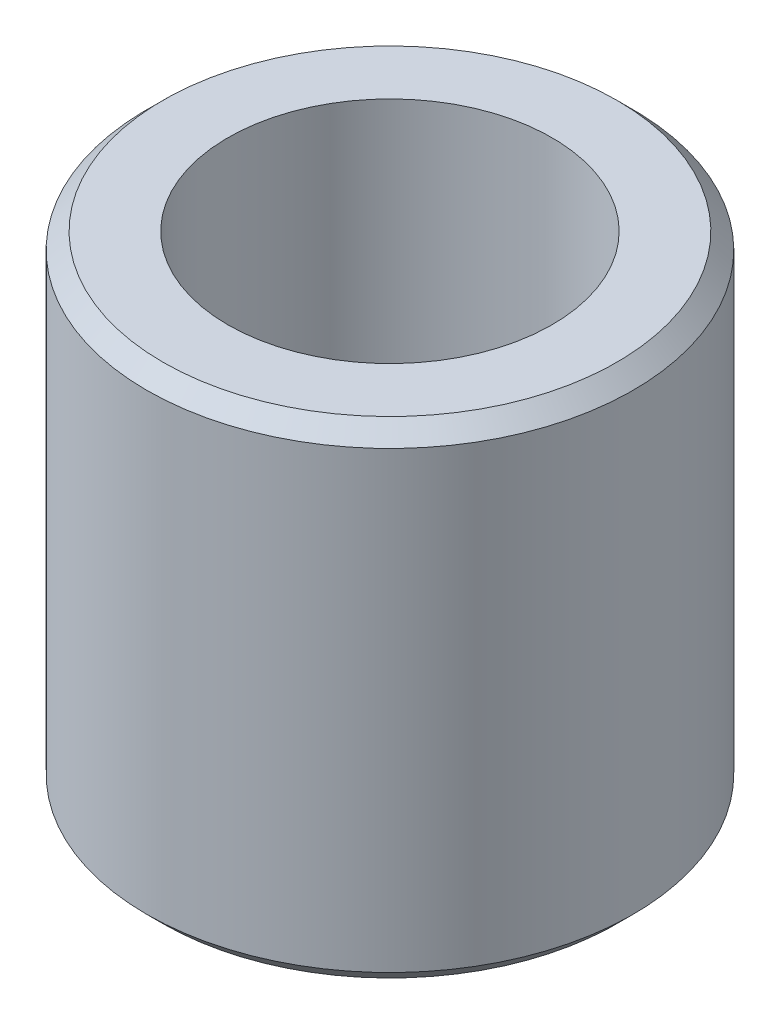
ISO-10303-21;
HEADER;
FILE_DESCRIPTION(('STEP AP214'),'2;1');
FILE_NAME('part.step','',(''),(''),'','','');
FILE_SCHEMA(('AUTOMOTIVE_DESIGN { 1 0 10303 214 1 1 1 1 }'));
ENDSEC;
DATA;
#1=APPLICATION_CONTEXT('core data for automotive mechanical design processes');
#2=APPLICATION_PROTOCOL_DEFINITION('international standard','automotive_design',2000,#1);
#3=PRODUCT_CONTEXT('',#1,'mechanical');
#4=PRODUCT('Part','Part','',(#3));
#5=PRODUCT_RELATED_PRODUCT_CATEGORY('part','',(#4));
#6=PRODUCT_DEFINITION_FORMATION('','',#4);
#7=PRODUCT_DEFINITION_CONTEXT('part definition',#1,'design');
#8=PRODUCT_DEFINITION('design','',#6,#7);
#9=PRODUCT_DEFINITION_SHAPE('','',#8);
#10=(LENGTH_UNIT() NAMED_UNIT(*) SI_UNIT(.MILLI.,.METRE.));
#11=(NAMED_UNIT(*) PLANE_ANGLE_UNIT() SI_UNIT($,.RADIAN.));
#12=(NAMED_UNIT(*) SI_UNIT($,.STERADIAN.) SOLID_ANGLE_UNIT());
#13=UNCERTAINTY_MEASURE_WITH_UNIT(LENGTH_MEASURE(1.E-05),#10,'distance_accuracy_value','');
#14=(GEOMETRIC_REPRESENTATION_CONTEXT(3) GLOBAL_UNCERTAINTY_ASSIGNED_CONTEXT((#13)) GLOBAL_UNIT_ASSIGNED_CONTEXT((#10,
#11,#12)) REPRESENTATION_CONTEXT('',''));
#15=CARTESIAN_POINT('',(0.,0.,0.));
#16=DIRECTION('',(0.,0.,1.));
#17=DIRECTION('',(1.,0.,0.));
#18=AXIS2_PLACEMENT_3D('',#15,#16,#17);
#19=CARTESIAN_POINT('',(0.,381.,0.));
#20=DIRECTION('',(0.,1.,0.));
#21=DIRECTION('',(0.,0.,1.));
#22=AXIS2_PLACEMENT_3D('',#19,#20,#21);
#23=PLANE('',#22);
#24=CARTESIAN_POINT('',(0.,381.,0.));
#25=DIRECTION('',(0.,1.,0.));
#26=DIRECTION('',(0.,0.,1.));
#27=AXIS2_PLACEMENT_3D('',#24,#25,#26);
#28=CIRCLE('',#27,355.6);
#29=CARTESIAN_POINT('',(0.,381.,355.6));
#30=VERTEX_POINT('',#29);
#31=EDGE_CURVE('E10',#30,#30,#28,.T.);
#32=ORIENTED_EDGE('',*,*,#31,.T.);
#33=EDGE_LOOP('',(#32));
#34=FACE_BOUND('',#33,.T.);
#35=CARTESIAN_POINT('',(0.,381.,0.));
#36=DIRECTION('',(0.,1.,0.));
#37=DIRECTION('',(0.,0.,1.));
#38=AXIS2_PLACEMENT_3D('',#35,#36,#37);
#39=CIRCLE('',#38,254.);
#40=CARTESIAN_POINT('',(0.,381.,254.));
#41=VERTEX_POINT('',#40);
#42=EDGE_CURVE('E65',#41,#41,#39,.T.);
#43=ORIENTED_EDGE('',*,*,#42,.F.);
#44=EDGE_LOOP('',(#43));
#45=FACE_BOUND('',#44,.T.);
#46=ADVANCED_FACE('F40',(#34,#45),#23,.T.);
#47=CARTESIAN_POINT('',(0.,-381.,0.));
#48=DIRECTION('',(0.,1.,0.));
#49=DIRECTION('',(0.,0.,1.));
#50=AXIS2_PLACEMENT_3D('',#47,#48,#49);
#51=PLANE('',#50);
#52=CARTESIAN_POINT('',(0.,-381.,0.));
#53=DIRECTION('',(0.,1.,0.));
#54=DIRECTION('',(0.,0.,1.));
#55=AXIS2_PLACEMENT_3D('',#52,#53,#54);
#56=CIRCLE('',#55,355.6);
#57=CARTESIAN_POINT('',(0.,-381.,355.6));
#58=VERTEX_POINT('',#57);
#59=EDGE_CURVE('E49',#58,#58,#56,.F.);
#60=ORIENTED_EDGE('',*,*,#59,.T.);
#61=EDGE_LOOP('',(#60));
#62=FACE_BOUND('',#61,.T.);
#63=CARTESIAN_POINT('',(0.,-381.,0.));
#64=DIRECTION('',(0.,1.,0.));
#65=DIRECTION('',(0.,0.,1.));
#66=AXIS2_PLACEMENT_3D('',#63,#64,#65);
#67=CIRCLE('',#66,254.);
#68=CARTESIAN_POINT('',(0.,-381.,254.));
#69=VERTEX_POINT('',#68);
#70=EDGE_CURVE('E66',#69,#69,#67,.T.);
#71=ORIENTED_EDGE('',*,*,#70,.T.);
#72=EDGE_LOOP('',(#71));
#73=FACE_BOUND('',#72,.T.);
#74=ADVANCED_FACE('F78',(#62,#73),#51,.F.);
#75=CARTESIAN_POINT('',(0.,381.,0.));
#76=DIRECTION('',(0.,-1.,0.));
#77=DIRECTION('',(0.,0.,-1.));
#78=AXIS2_PLACEMENT_3D('',#75,#76,#77);
#79=CYLINDRICAL_SURFACE('',#78,381.);
#80=CARTESIAN_POINT('',(0.,-355.6,0.));
#81=DIRECTION('',(0.,1.,0.));
#82=DIRECTION('',(0.,0.,1.));
#83=AXIS2_PLACEMENT_3D('',#80,#81,#82);
#84=CIRCLE('',#83,381.);
#85=CARTESIAN_POINT('',(0.,-355.6,381.));
#86=VERTEX_POINT('',#85);
#87=EDGE_CURVE('E54',#86,#86,#84,.T.);
#88=ORIENTED_EDGE('',*,*,#87,.T.);
#89=EDGE_LOOP('',(#88));
#90=FACE_BOUND('',#89,.T.);
#91=CARTESIAN_POINT('',(0.,355.6,0.));
#92=DIRECTION('',(0.,1.,0.));
#93=DIRECTION('',(0.,0.,1.));
#94=AXIS2_PLACEMENT_3D('',#91,#92,#93);
#95=CIRCLE('',#94,381.);
#96=CARTESIAN_POINT('',(0.,355.6,381.));
#97=VERTEX_POINT('',#96);
#98=EDGE_CURVE('E59',#97,#97,#95,.F.);
#99=ORIENTED_EDGE('',*,*,#98,.T.);
#100=EDGE_LOOP('',(#99));
#101=FACE_BOUND('',#100,.T.);
#102=ADVANCED_FACE('F83',(#90,#101),#79,.T.);
#103=CARTESIAN_POINT('',(0.,381.,0.));
#104=DIRECTION('',(0.,-1.,0.));
#105=DIRECTION('',(0.,0.,-1.));
#106=AXIS2_PLACEMENT_3D('',#103,#104,#105);
#107=CYLINDRICAL_SURFACE('',#106,254.);
#108=ORIENTED_EDGE('',*,*,#42,.T.);
#109=EDGE_LOOP('',(#108));
#110=FACE_BOUND('',#109,.T.);
#111=ORIENTED_EDGE('',*,*,#70,.F.);
#112=EDGE_LOOP('',(#111));
#113=FACE_BOUND('',#112,.T.);
#114=ADVANCED_FACE('F74',(#110,#113),#107,.F.);
#115=CARTESIAN_POINT('',(0.,-355.6,0.));
#116=DIRECTION('',(0.,1.,0.));
#117=DIRECTION('',(0.,0.,1.));
#118=AXIS2_PLACEMENT_3D('',#115,#116,#117);
#119=CONICAL_SURFACE('',#118,381.,0.785398163397449);
#120=CARTESIAN_POINT('',(0.,-381.,355.6));
#121=CARTESIAN_POINT('',(0.,-380.735416666667,355.864583333333));
#122=CARTESIAN_POINT('',(0.,-380.470833333333,356.129166666666));
#123=CARTESIAN_POINT('',(0.,-379.941666666667,356.658333333333));
#124=CARTESIAN_POINT('',(0.,-379.677083333333,356.922916666666));
#125=CARTESIAN_POINT('',(0.,-379.147916666667,357.452083333333));
#126=CARTESIAN_POINT('',(0.,-378.883333333333,357.716666666667));
#127=CARTESIAN_POINT('',(0.,-378.354166666667,358.245833333333));
#128=CARTESIAN_POINT('',(0.,-378.089583333333,358.510416666667));
#129=CARTESIAN_POINT('',(0.,-377.560416666667,359.039583333333));
#130=CARTESIAN_POINT('',(0.,-377.295833333333,359.304166666667));
#131=CARTESIAN_POINT('',(0.,-376.766666666667,359.833333333333));
#132=CARTESIAN_POINT('',(0.,-376.502083333333,360.097916666666));
#133=CARTESIAN_POINT('',(0.,-375.972916666667,360.627083333333));
#134=CARTESIAN_POINT('',(0.,-375.708333333333,360.891666666666));
#135=CARTESIAN_POINT('',(0.,-375.179166666667,361.420833333333));
#136=CARTESIAN_POINT('',(0.,-374.914583333333,361.685416666667));
#137=CARTESIAN_POINT('',(0.,-374.385416666667,362.214583333333));
#138=CARTESIAN_POINT('',(0.,-374.120833333333,362.479166666667));
#139=CARTESIAN_POINT('',(0.,-373.591666666667,363.008333333333));
#140=CARTESIAN_POINT('',(0.,-373.327083333333,363.272916666667));
#141=CARTESIAN_POINT('',(0.,-372.797916666667,363.802083333333));
#142=CARTESIAN_POINT('',(0.,-372.533333333333,364.066666666667));
#143=CARTESIAN_POINT('',(0.,-372.004166666667,364.595833333333));
#144=CARTESIAN_POINT('',(0.,-371.739583333333,364.860416666667));
#145=CARTESIAN_POINT('',(0.,-371.210416666667,365.389583333333));
#146=CARTESIAN_POINT('',(0.,-370.945833333333,365.654166666667));
#147=CARTESIAN_POINT('',(0.,-370.416666666667,366.183333333333));
#148=CARTESIAN_POINT('',(0.,-370.152083333333,366.447916666667));
#149=CARTESIAN_POINT('',(0.,-369.622916666667,366.977083333333));
#150=CARTESIAN_POINT('',(0.,-369.358333333333,367.241666666667));
#151=CARTESIAN_POINT('',(0.,-368.829166666667,367.770833333333));
#152=CARTESIAN_POINT('',(0.,-368.564583333333,368.035416666667));
#153=CARTESIAN_POINT('',(0.,-368.035416666667,368.564583333333));
#154=CARTESIAN_POINT('',(0.,-367.770833333333,368.829166666667));
#155=CARTESIAN_POINT('',(0.,-367.241666666667,369.358333333333));
#156=CARTESIAN_POINT('',(0.,-366.977083333333,369.622916666667));
#157=CARTESIAN_POINT('',(0.,-366.447916666667,370.152083333333));
#158=CARTESIAN_POINT('',(0.,-366.183333333333,370.416666666667));
#159=CARTESIAN_POINT('',(0.,-365.654166666667,370.945833333333));
#160=CARTESIAN_POINT('',(0.,-365.389583333333,371.210416666667));
#161=CARTESIAN_POINT('',(0.,-364.860416666667,371.739583333333));
#162=CARTESIAN_POINT('',(0.,-364.595833333333,372.004166666667));
#163=CARTESIAN_POINT('',(0.,-364.066666666667,372.533333333333));
#164=CARTESIAN_POINT('',(0.,-363.802083333333,372.797916666667));
#165=CARTESIAN_POINT('',(0.,-363.272916666667,373.327083333333));
#166=CARTESIAN_POINT('',(0.,-363.008333333333,373.591666666667));
#167=CARTESIAN_POINT('',(0.,-362.479166666667,374.120833333333));
#168=CARTESIAN_POINT('',(0.,-362.214583333333,374.385416666667));
#169=CARTESIAN_POINT('',(0.,-361.685416666667,374.914583333333));
#170=CARTESIAN_POINT('',(0.,-361.420833333333,375.179166666667));
#171=CARTESIAN_POINT('',(0.,-360.891666666667,375.708333333333));
#172=CARTESIAN_POINT('',(0.,-360.627083333333,375.972916666667));
#173=CARTESIAN_POINT('',(0.,-360.097916666667,376.502083333333));
#174=CARTESIAN_POINT('',(0.,-359.833333333333,376.766666666667));
#175=CARTESIAN_POINT('',(0.,-359.304166666667,377.295833333333));
#176=CARTESIAN_POINT('',(0.,-359.039583333333,377.560416666667));
#177=CARTESIAN_POINT('',(0.,-358.510416666667,378.089583333333));
#178=CARTESIAN_POINT('',(0.,-358.245833333333,378.354166666667));
#179=CARTESIAN_POINT('',(0.,-357.716666666667,378.883333333333));
#180=CARTESIAN_POINT('',(0.,-357.452083333333,379.147916666667));
#181=CARTESIAN_POINT('',(0.,-356.922916666667,379.677083333333));
#182=CARTESIAN_POINT('',(0.,-356.658333333333,379.941666666667));
#183=CARTESIAN_POINT('',(0.,-356.129166666667,380.470833333333));
#184=CARTESIAN_POINT('',(0.,-355.864583333333,380.735416666667));
#185=CARTESIAN_POINT('',(0.,-355.6,381.));
#186=B_SPLINE_CURVE_WITH_KNOTS('',3,(#120,#121,#122,#123,#124,#125,#126,#127,#128,#129,#130,
#131,#132,#133,#134,#135,#136,#137,#138,#139,#140,#141,#142,#143,#144,#145,#146,#147,#148,#149,
#150,#151,#152,#153,#154,#155,#156,#157,#158,#159,#160,#161,#162,#163,#164,#165,#166,#167,#168,
#169,#170,#171,#172,#173,#174,#175,#176,#177,#178,#179,#180,#181,#182,#183,#184,#185),
.UNSPECIFIED.,.F.,.F.,(4,2,2,2,2,2,2,2,2,2,2,2,2,2,2,2,2,2,2,2,2,2,2,2,2,2,2,2,2,2,2,2,4),(0.,
1.1225320151337,2.24506403026732,3.36759604540101,4.49012806053463,5.61266007566825,
6.73519209080195,7.85772410593557,8.98025612106922,10.1027881362029,11.2253201513365,
12.3478521664702,13.4703841816038,14.5929161967375,15.7154482118711,16.8379802270048,
17.9605122421384,19.0830442572721,20.2055762724057,21.3281082875394,22.450640302673,
23.5731723178067,24.6957043329403,25.818236348074,26.9407683632076,28.0633003783413,
29.1858323934749,30.3083644086086,31.4308964237422,32.5534284388758,33.6759604540095,
34.7984924691432,35.9210244842768),.UNSPECIFIED.);
#187=EDGE_CURVE('BSEAM90',#58,#86,#186,.T.);
#188=ORIENTED_EDGE('',*,*,#59,.F.);
#189=ORIENTED_EDGE('',*,*,#87,.F.);
#190=ORIENTED_EDGE('',*,*,#187,.T.);
#191=ORIENTED_EDGE('',*,*,#187,.F.);
#192=EDGE_LOOP('',(#188,#190,#189,#191));
#193=FACE_BOUND('',#192,.T.);
#194=ADVANCED_FACE('F90',(#193),#119,.T.);
#195=CARTESIAN_POINT('',(0.,381.,0.));
#196=DIRECTION('',(0.,-1.,0.));
#197=DIRECTION('',(0.,0.,-1.));
#198=AXIS2_PLACEMENT_3D('',#195,#196,#197);
#199=CONICAL_SURFACE('',#198,355.6,0.785398163397443);
#200=ORIENTED_EDGE('',*,*,#98,.F.);
#201=EDGE_LOOP('',(#200));
#202=FACE_BOUND('',#201,.T.);
#203=ORIENTED_EDGE('',*,*,#31,.F.);
#204=EDGE_LOOP('',(#203));
#205=FACE_BOUND('',#204,.T.);
#206=ADVANCED_FACE('F43',(#202,#205),#199,.T.);
#207=CLOSED_SHELL('',(#46,#74,#102,#114,#194,#206));
#208=MANIFOLD_SOLID_BREP('B2',#207);
#209=ADVANCED_BREP_SHAPE_REPRESENTATION('',(#18,#208),#14);
#210=SHAPE_DEFINITION_REPRESENTATION(#9,#209);
ENDSEC;
END-ISO-10303-21;
